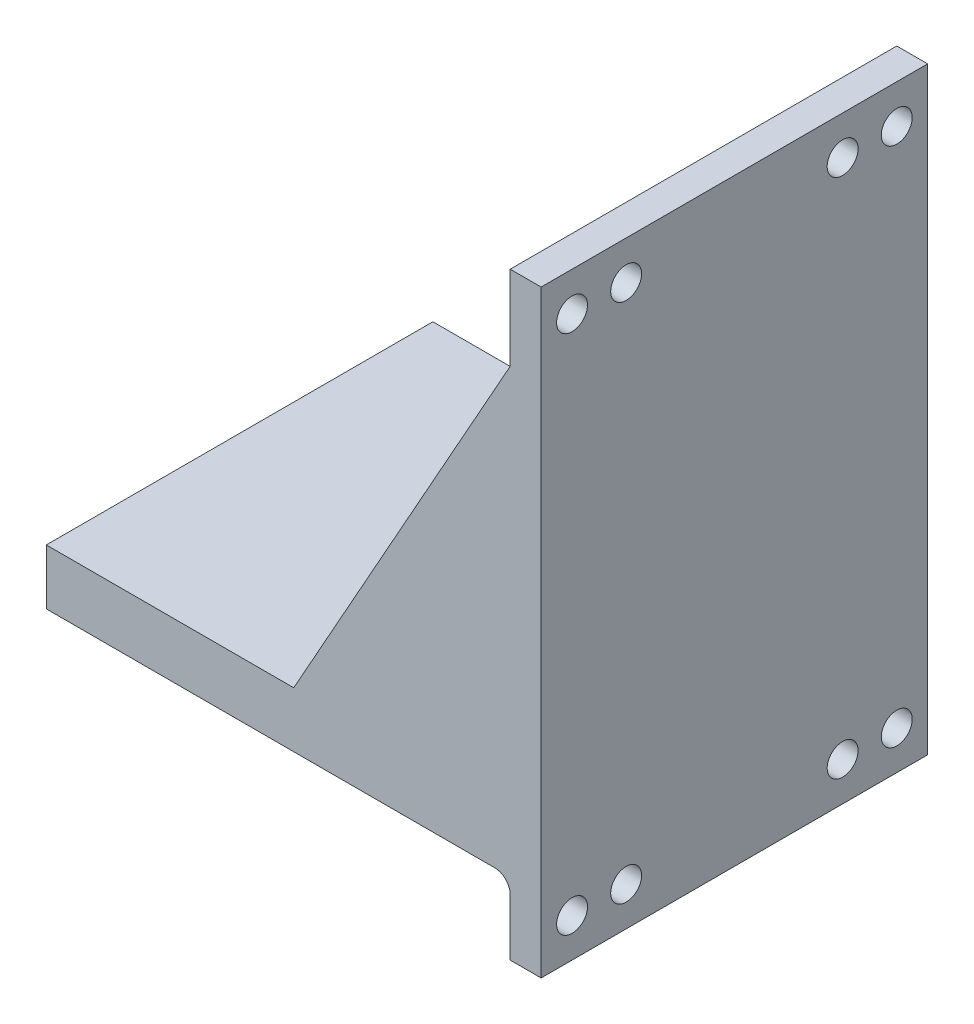
ISO-10303-21;
HEADER;
FILE_DESCRIPTION(('STEP AP214'),'2;1');
FILE_NAME('part.step','',(''),(''),'','','');
FILE_SCHEMA(('AUTOMOTIVE_DESIGN { 1 0 10303 214 1 1 1 1 }'));
ENDSEC;
DATA;
#1=APPLICATION_CONTEXT('core data for automotive mechanical design processes');
#2=APPLICATION_PROTOCOL_DEFINITION('international standard','automotive_design',2000,#1);
#3=PRODUCT_CONTEXT('',#1,'mechanical');
#4=PRODUCT('Part','Part','',(#3));
#5=PRODUCT_RELATED_PRODUCT_CATEGORY('part','',(#4));
#6=PRODUCT_DEFINITION_FORMATION('','',#4);
#7=PRODUCT_DEFINITION_CONTEXT('part definition',#1,'design');
#8=PRODUCT_DEFINITION('design','',#6,#7);
#9=PRODUCT_DEFINITION_SHAPE('','',#8);
#10=(LENGTH_UNIT() NAMED_UNIT(*) SI_UNIT(.MILLI.,.METRE.));
#11=(NAMED_UNIT(*) PLANE_ANGLE_UNIT() SI_UNIT($,.RADIAN.));
#12=(NAMED_UNIT(*) SI_UNIT($,.STERADIAN.) SOLID_ANGLE_UNIT());
#13=UNCERTAINTY_MEASURE_WITH_UNIT(LENGTH_MEASURE(1.E-05),#10,'distance_accuracy_value','');
#14=(GEOMETRIC_REPRESENTATION_CONTEXT(3) GLOBAL_UNCERTAINTY_ASSIGNED_CONTEXT((#13)) GLOBAL_UNIT_ASSIGNED_CONTEXT((#10,
#11,#12)) REPRESENTATION_CONTEXT('',''));
#15=CARTESIAN_POINT('',(0.,0.,0.));
#16=DIRECTION('',(0.,0.,1.));
#17=DIRECTION('',(1.,0.,0.));
#18=AXIS2_PLACEMENT_3D('',#15,#16,#17);
#19=CARTESIAN_POINT('',(-12.,0.,0.));
#20=DIRECTION('',(-1.,0.,0.));
#21=DIRECTION('',(0.,0.,1.));
#22=AXIS2_PLACEMENT_3D('',#19,#20,#21);
#23=PLANE('',#22);
#24=DIRECTION('',(0.,1.,0.));
#25=VECTOR('',#24,1.);
#26=CARTESIAN_POINT('',(-12.,-22.188809941931,43.1107059078754));
#27=LINE('',#26,#25);
#28=CARTESIAN_POINT('',(-12.,-31.3570983107345,43.1107059078754));
#29=VERTEX_POINT('',#28);
#30=CARTESIAN_POINT('',(-12.,-22.188809941931,43.1107059078754));
#31=VERTEX_POINT('',#30);
#32=EDGE_CURVE('E57',#29,#31,#27,.T.);
#33=ORIENTED_EDGE('',*,*,#32,.F.);
#34=DIRECTION('',(0.,0.,1.));
#35=VECTOR('',#34,1.);
#36=CARTESIAN_POINT('',(-12.,-31.3570983107345,0.));
#37=LINE('',#36,#35);
#38=CARTESIAN_POINT('',(-12.,-31.3570983107345,30.1107059078754));
#39=VERTEX_POINT('',#38);
#40=EDGE_CURVE('E63',#29,#39,#37,.F.);
#41=ORIENTED_EDGE('',*,*,#40,.T.);
#42=DIRECTION('',(0.,-1.,0.));
#43=VECTOR('',#42,1.);
#44=CARTESIAN_POINT('',(-12.,38.7,30.1107059078754));
#45=LINE('',#44,#43);
#46=CARTESIAN_POINT('',(-12.,-38.7,30.1107059078754));
#47=VERTEX_POINT('',#46);
#48=EDGE_CURVE('E301',#39,#47,#45,.T.);
#49=ORIENTED_EDGE('',*,*,#48,.T.);
#50=DIRECTION('',(0.,0.,1.));
#51=VECTOR('',#50,1.);
#52=CARTESIAN_POINT('',(-12.,-38.7,30.1107059078754));
#53=LINE('',#52,#51);
#54=CARTESIAN_POINT('',(-12.,-38.7,80.1107059078754));
#55=VERTEX_POINT('',#54);
#56=EDGE_CURVE('E297',#47,#55,#53,.T.);
#57=ORIENTED_EDGE('',*,*,#56,.T.);
#58=DIRECTION('',(0.,1.,0.));
#59=VECTOR('',#58,1.);
#60=CARTESIAN_POINT('',(-12.,38.7,80.1107059078754));
#61=LINE('',#60,#59);
#62=CARTESIAN_POINT('',(-12.,-31.3570983107345,80.1107059078754));
#63=VERTEX_POINT('',#62);
#64=EDGE_CURVE('E302',#55,#63,#61,.T.);
#65=ORIENTED_EDGE('',*,*,#64,.T.);
#66=DIRECTION('',(0.,0.,1.));
#67=VECTOR('',#66,1.);
#68=CARTESIAN_POINT('',(-12.,-31.3570983107345,0.));
#69=LINE('',#68,#67);
#70=CARTESIAN_POINT('',(-12.,-31.3570983107345,56.1107059078754));
#71=VERTEX_POINT('',#70);
#72=EDGE_CURVE('E333',#63,#71,#69,.F.);
#73=ORIENTED_EDGE('',*,*,#72,.T.);
#74=DIRECTION('',(0.,1.,0.));
#75=VECTOR('',#74,1.);
#76=CARTESIAN_POINT('',(-12.,-38.7,56.1107059078754));
#77=LINE('',#76,#75);
#78=CARTESIAN_POINT('',(-12.,-22.188809941931,56.1107059078754));
#79=VERTEX_POINT('',#78);
#80=EDGE_CURVE('E224',#71,#79,#77,.T.);
#81=ORIENTED_EDGE('',*,*,#80,.T.);
#82=DIRECTION('',(0.,0.,-1.));
#83=VECTOR('',#82,1.);
#84=CARTESIAN_POINT('',(-12.,-22.188809941931,80.1107059078754));
#85=LINE('',#84,#83);
#86=CARTESIAN_POINT('',(-12.,-22.188809941931,66.1107059078754));
#87=VERTEX_POINT('',#86);
#88=EDGE_CURVE('E228',#87,#79,#85,.T.);
#89=ORIENTED_EDGE('',*,*,#88,.F.);
#90=DIRECTION('',(0.,1.,0.));
#91=VECTOR('',#90,1.);
#92=CARTESIAN_POINT('',(-12.,0.,66.1107059078754));
#93=LINE('',#92,#91);
#94=CARTESIAN_POINT('',(-12.,27.811190058069,66.1107059078754));
#95=VERTEX_POINT('',#94);
#96=EDGE_CURVE('E214',#87,#95,#93,.T.);
#97=ORIENTED_EDGE('',*,*,#96,.T.);
#98=DIRECTION('',(0.,0.,1.));
#99=VECTOR('',#98,1.);
#100=CARTESIAN_POINT('',(-12.,27.811190058069,0.));
#101=LINE('',#100,#99);
#102=CARTESIAN_POINT('',(-12.,27.811190058069,80.1107059078754));
#103=VERTEX_POINT('',#102);
#104=EDGE_CURVE('E220',#103,#95,#101,.F.);
#105=ORIENTED_EDGE('',*,*,#104,.F.);
#106=CARTESIAN_POINT('',(-12.,38.7,80.1107059078754));
#107=VERTEX_POINT('',#106);
#108=EDGE_CURVE('E303',#103,#107,#61,.T.);
#109=ORIENTED_EDGE('',*,*,#108,.T.);
#110=DIRECTION('',(0.,0.,-1.));
#111=VECTOR('',#110,1.);
#112=CARTESIAN_POINT('',(-12.,38.7,30.1107059078754));
#113=LINE('',#112,#111);
#114=CARTESIAN_POINT('',(-12.,38.7,30.1107059078754));
#115=VERTEX_POINT('',#114);
#116=EDGE_CURVE('E310',#107,#115,#113,.T.);
#117=ORIENTED_EDGE('',*,*,#116,.T.);
#118=CARTESIAN_POINT('',(-12.,27.811190058069,30.1107059078754));
#119=VERTEX_POINT('',#118);
#120=EDGE_CURVE('E300',#115,#119,#45,.T.);
#121=ORIENTED_EDGE('',*,*,#120,.T.);
#122=DIRECTION('',(0.,0.,-1.));
#123=VECTOR('',#122,1.);
#124=CARTESIAN_POINT('',(-12.,27.811190058069,36.1107059078754));
#125=LINE('',#124,#123);
#126=CARTESIAN_POINT('',(-12.,27.811190058069,36.1107059078754));
#127=VERTEX_POINT('',#126);
#128=EDGE_CURVE('E179',#127,#119,#125,.T.);
#129=ORIENTED_EDGE('',*,*,#128,.F.);
#130=DIRECTION('',(0.,-1.,0.));
#131=VECTOR('',#130,1.);
#132=CARTESIAN_POINT('',(-12.,27.811190058069,36.1107059078754));
#133=LINE('',#132,#131);
#134=CARTESIAN_POINT('',(-12.,-22.188809941931,36.1107059078754));
#135=VERTEX_POINT('',#134);
#136=EDGE_CURVE('E181',#127,#135,#133,.T.);
#137=ORIENTED_EDGE('',*,*,#136,.T.);
#138=DIRECTION('',(0.,0.,-1.));
#139=VECTOR('',#138,1.);
#140=CARTESIAN_POINT('',(-12.,-22.188809941931,30.1107059078754));
#141=LINE('',#140,#139);
#142=EDGE_CURVE('E194',#31,#135,#141,.T.);
#143=ORIENTED_EDGE('',*,*,#142,.F.);
#144=EDGE_LOOP('',(#33,#41,#49,#57,#65,#73,#81,#89,#97,#105,#109,#117,#121,#129,#137,#143));
#145=FACE_BOUND('',#144,.T.);
#146=CARTESIAN_POINT('',(-12.,-33.7,76.1107059078754));
#147=DIRECTION('',(-1.,0.,0.));
#148=DIRECTION('',(0.,0.,-1.));
#149=AXIS2_PLACEMENT_3D('',#146,#147,#148);
#150=CIRCLE('',#149,2.);
#151=CARTESIAN_POINT('',(-12.,-33.7,74.1107059078754));
#152=VERTEX_POINT('',#151);
#153=EDGE_CURVE('E248',#152,#152,#150,.T.);
#154=ORIENTED_EDGE('',*,*,#153,.F.);
#155=EDGE_LOOP('',(#154));
#156=FACE_BOUND('',#155,.T.);
#157=CARTESIAN_POINT('',(-12.,-33.7,69.1107059078754));
#158=DIRECTION('',(-1.,0.,0.));
#159=DIRECTION('',(0.,0.,-1.));
#160=AXIS2_PLACEMENT_3D('',#157,#158,#159);
#161=CIRCLE('',#160,2.);
#162=CARTESIAN_POINT('',(-12.,-33.7,67.1107059078754));
#163=VERTEX_POINT('',#162);
#164=EDGE_CURVE('E253',#163,#163,#161,.T.);
#165=ORIENTED_EDGE('',*,*,#164,.F.);
#166=EDGE_LOOP('',(#165));
#167=FACE_BOUND('',#166,.T.);
#168=CARTESIAN_POINT('',(-12.,-33.7,41.1107059078754));
#169=DIRECTION('',(-1.,0.,0.));
#170=DIRECTION('',(0.,0.,-1.));
#171=AXIS2_PLACEMENT_3D('',#168,#169,#170);
#172=CIRCLE('',#171,2.);
#173=CARTESIAN_POINT('',(-12.,-33.7,39.1107059078754));
#174=VERTEX_POINT('',#173);
#175=EDGE_CURVE('E264',#174,#174,#172,.T.);
#176=ORIENTED_EDGE('',*,*,#175,.F.);
#177=EDGE_LOOP('',(#176));
#178=FACE_BOUND('',#177,.T.);
#179=CARTESIAN_POINT('',(-12.,-33.7,34.1107059078754));
#180=DIRECTION('',(-1.,0.,0.));
#181=DIRECTION('',(0.,0.,-1.));
#182=AXIS2_PLACEMENT_3D('',#179,#180,#181);
#183=CIRCLE('',#182,2.);
#184=CARTESIAN_POINT('',(-12.,-33.7,32.1107059078754));
#185=VERTEX_POINT('',#184);
#186=EDGE_CURVE('E267',#185,#185,#183,.T.);
#187=ORIENTED_EDGE('',*,*,#186,.F.);
#188=EDGE_LOOP('',(#187));
#189=FACE_BOUND('',#188,.T.);
#190=CARTESIAN_POINT('',(-12.,33.7,76.1107059078754));
#191=DIRECTION('',(-1.,0.,0.));
#192=DIRECTION('',(0.,0.,1.));
#193=AXIS2_PLACEMENT_3D('',#190,#191,#192);
#194=CIRCLE('',#193,2.);
#195=CARTESIAN_POINT('',(-12.,33.7,78.1107059078754));
#196=VERTEX_POINT('',#195);
#197=EDGE_CURVE('E271',#196,#196,#194,.T.);
#198=ORIENTED_EDGE('',*,*,#197,.F.);
#199=EDGE_LOOP('',(#198));
#200=FACE_BOUND('',#199,.T.);
#201=CARTESIAN_POINT('',(-12.,33.7,41.1107059078754));
#202=DIRECTION('',(-1.,0.,0.));
#203=DIRECTION('',(0.,0.,1.));
#204=AXIS2_PLACEMENT_3D('',#201,#202,#203);
#205=CIRCLE('',#204,2.);
#206=CARTESIAN_POINT('',(-12.,33.7,43.1107059078754));
#207=VERTEX_POINT('',#206);
#208=EDGE_CURVE('E282',#207,#207,#205,.T.);
#209=ORIENTED_EDGE('',*,*,#208,.F.);
#210=EDGE_LOOP('',(#209));
#211=FACE_BOUND('',#210,.T.);
#212=CARTESIAN_POINT('',(-12.,33.7,34.1107059078754));
#213=DIRECTION('',(-1.,0.,0.));
#214=DIRECTION('',(0.,0.,1.));
#215=AXIS2_PLACEMENT_3D('',#212,#213,#214);
#216=CIRCLE('',#215,2.);
#217=CARTESIAN_POINT('',(-12.,33.7,36.1107059078754));
#218=VERTEX_POINT('',#217);
#219=EDGE_CURVE('E293',#218,#218,#216,.T.);
#220=ORIENTED_EDGE('',*,*,#219,.F.);
#221=EDGE_LOOP('',(#220));
#222=FACE_BOUND('',#221,.T.);
#223=CARTESIAN_POINT('',(-12.,33.7,69.1107059078754));
#224=DIRECTION('',(-1.,0.,0.));
#225=DIRECTION('',(0.,0.,1.));
#226=AXIS2_PLACEMENT_3D('',#223,#224,#225);
#227=CIRCLE('',#226,2.);
#228=CARTESIAN_POINT('',(-12.,33.7,71.1107059078754));
#229=VERTEX_POINT('',#228);
#230=EDGE_CURVE('E280',#229,#229,#227,.T.);
#231=ORIENTED_EDGE('',*,*,#230,.F.);
#232=EDGE_LOOP('',(#231));
#233=FACE_BOUND('',#232,.T.);
#234=ADVANCED_FACE('F41',(#145,#156,#167,#178,#189,#200,#211,#222,#233),#23,.T.);
#235=CARTESIAN_POINT('',(-8.,0.,0.));
#236=DIRECTION('',(-1.,0.,0.));
#237=DIRECTION('',(0.,0.,1.));
#238=AXIS2_PLACEMENT_3D('',#235,#236,#237);
#239=PLANE('',#238);
#240=CARTESIAN_POINT('',(-8.,33.7,76.1107059078754));
#241=DIRECTION('',(-1.,0.,0.));
#242=DIRECTION('',(0.,0.,1.));
#243=AXIS2_PLACEMENT_3D('',#240,#241,#242);
#244=CIRCLE('',#243,2.);
#245=CARTESIAN_POINT('',(-8.,33.7,78.1107059078754));
#246=VERTEX_POINT('',#245);
#247=EDGE_CURVE('E270',#246,#246,#244,.T.);
#248=ORIENTED_EDGE('',*,*,#247,.T.);
#249=EDGE_LOOP('',(#248));
#250=FACE_BOUND('',#249,.T.);
#251=CARTESIAN_POINT('',(-8.,33.7,69.1107059078754));
#252=DIRECTION('',(-1.,0.,0.));
#253=DIRECTION('',(0.,0.,1.));
#254=AXIS2_PLACEMENT_3D('',#251,#252,#253);
#255=CIRCLE('',#254,2.);
#256=CARTESIAN_POINT('',(-8.,33.7,71.1107059078754));
#257=VERTEX_POINT('',#256);
#258=EDGE_CURVE('E278',#257,#257,#255,.T.);
#259=ORIENTED_EDGE('',*,*,#258,.T.);
#260=EDGE_LOOP('',(#259));
#261=FACE_BOUND('',#260,.T.);
#262=CARTESIAN_POINT('',(-8.,33.7,34.1107059078754));
#263=DIRECTION('',(-1.,0.,0.));
#264=DIRECTION('',(0.,0.,1.));
#265=AXIS2_PLACEMENT_3D('',#262,#263,#264);
#266=CIRCLE('',#265,2.);
#267=CARTESIAN_POINT('',(-8.,33.7,36.1107059078754));
#268=VERTEX_POINT('',#267);
#269=EDGE_CURVE('E289',#268,#268,#266,.T.);
#270=ORIENTED_EDGE('',*,*,#269,.T.);
#271=EDGE_LOOP('',(#270));
#272=FACE_BOUND('',#271,.T.);
#273=CARTESIAN_POINT('',(-8.,33.7,41.1107059078754));
#274=DIRECTION('',(-1.,0.,0.));
#275=DIRECTION('',(0.,0.,1.));
#276=AXIS2_PLACEMENT_3D('',#273,#274,#275);
#277=CIRCLE('',#276,2.);
#278=CARTESIAN_POINT('',(-8.,33.7,43.1107059078754));
#279=VERTEX_POINT('',#278);
#280=EDGE_CURVE('E281',#279,#279,#277,.T.);
#281=ORIENTED_EDGE('',*,*,#280,.T.);
#282=EDGE_LOOP('',(#281));
#283=FACE_BOUND('',#282,.T.);
#284=DIRECTION('',(0.,0.,-1.));
#285=VECTOR('',#284,1.);
#286=CARTESIAN_POINT('',(-8.,38.7,30.1107059078754));
#287=LINE('',#286,#285);
#288=CARTESIAN_POINT('',(-8.,38.7,80.1107059078754));
#289=VERTEX_POINT('',#288);
#290=CARTESIAN_POINT('',(-8.,38.7,30.1107059078754));
#291=VERTEX_POINT('',#290);
#292=EDGE_CURVE('E317',#289,#291,#287,.T.);
#293=ORIENTED_EDGE('',*,*,#292,.F.);
#294=DIRECTION('',(0.,1.,0.));
#295=VECTOR('',#294,1.);
#296=CARTESIAN_POINT('',(-8.,38.7,80.1107059078754));
#297=LINE('',#296,#295);
#298=CARTESIAN_POINT('',(-8.,-38.7,80.1107059078754));
#299=VERTEX_POINT('',#298);
#300=EDGE_CURVE('E313',#299,#289,#297,.T.);
#301=ORIENTED_EDGE('',*,*,#300,.F.);
#302=DIRECTION('',(0.,0.,1.));
#303=VECTOR('',#302,1.);
#304=CARTESIAN_POINT('',(-8.,-38.7,30.1107059078754));
#305=LINE('',#304,#303);
#306=CARTESIAN_POINT('',(-8.,-38.7,30.1107059078754));
#307=VERTEX_POINT('',#306);
#308=EDGE_CURVE('E315',#307,#299,#305,.T.);
#309=ORIENTED_EDGE('',*,*,#308,.F.);
#310=DIRECTION('',(0.,-1.,0.));
#311=VECTOR('',#310,1.);
#312=CARTESIAN_POINT('',(-8.,38.7,30.1107059078754));
#313=LINE('',#312,#311);
#314=EDGE_CURVE('E295',#291,#307,#313,.T.);
#315=ORIENTED_EDGE('',*,*,#314,.F.);
#316=EDGE_LOOP('',(#293,#301,#309,#315));
#317=FACE_BOUND('',#316,.T.);
#318=CARTESIAN_POINT('',(-8.,-33.7,34.1107059078754));
#319=DIRECTION('',(-1.,0.,0.));
#320=DIRECTION('',(0.,0.,-1.));
#321=AXIS2_PLACEMENT_3D('',#318,#319,#320);
#322=CIRCLE('',#321,2.);
#323=CARTESIAN_POINT('',(-8.,-33.7,32.1107059078754));
#324=VERTEX_POINT('',#323);
#325=EDGE_CURVE('E263',#324,#324,#322,.T.);
#326=ORIENTED_EDGE('',*,*,#325,.T.);
#327=EDGE_LOOP('',(#326));
#328=FACE_BOUND('',#327,.T.);
#329=CARTESIAN_POINT('',(-8.,-33.7,41.1107059078754));
#330=DIRECTION('',(-1.,0.,0.));
#331=DIRECTION('',(0.,0.,-1.));
#332=AXIS2_PLACEMENT_3D('',#329,#330,#331);
#333=CIRCLE('',#332,2.);
#334=CARTESIAN_POINT('',(-8.,-33.7,39.1107059078754));
#335=VERTEX_POINT('',#334);
#336=EDGE_CURVE('E257',#335,#335,#333,.T.);
#337=ORIENTED_EDGE('',*,*,#336,.T.);
#338=EDGE_LOOP('',(#337));
#339=FACE_BOUND('',#338,.T.);
#340=CARTESIAN_POINT('',(-8.,-33.7,76.1107059078754));
#341=DIRECTION('',(-1.,0.,0.));
#342=DIRECTION('',(0.,0.,-1.));
#343=AXIS2_PLACEMENT_3D('',#340,#341,#342);
#344=CIRCLE('',#343,2.);
#345=CARTESIAN_POINT('',(-8.,-33.7,74.1107059078754));
#346=VERTEX_POINT('',#345);
#347=EDGE_CURVE('E247',#346,#346,#344,.T.);
#348=ORIENTED_EDGE('',*,*,#347,.T.);
#349=EDGE_LOOP('',(#348));
#350=FACE_BOUND('',#349,.T.);
#351=CARTESIAN_POINT('',(-8.,-33.7,69.1107059078754));
#352=DIRECTION('',(-1.,0.,0.));
#353=DIRECTION('',(0.,0.,-1.));
#354=AXIS2_PLACEMENT_3D('',#351,#352,#353);
#355=CIRCLE('',#354,2.);
#356=CARTESIAN_POINT('',(-8.,-33.7,67.1107059078754));
#357=VERTEX_POINT('',#356);
#358=EDGE_CURVE('E255',#357,#357,#355,.T.);
#359=ORIENTED_EDGE('',*,*,#358,.T.);
#360=EDGE_LOOP('',(#359));
#361=FACE_BOUND('',#360,.T.);
#362=ADVANCED_FACE('F426',(#250,#261,#272,#283,#317,#328,#339,#350,#361),#239,.F.);
#363=CARTESIAN_POINT('',(-12.,38.7,30.1107059078754));
#364=DIRECTION('',(0.,0.,1.));
#365=DIRECTION('',(1.,0.,0.));
#366=AXIS2_PLACEMENT_3D('',#363,#364,#365);
#367=PLANE('',#366);
#368=DIRECTION('',(1.,0.,0.));
#369=VECTOR('',#368,1.);
#370=CARTESIAN_POINT('',(-72.,-22.188809941931,30.1107059078754));
#371=LINE('',#370,#369);
#372=CARTESIAN_POINT('',(-72.,-22.188809941931,30.1107059078754));
#373=VERTEX_POINT('',#372);
#374=CARTESIAN_POINT('',(-42.,-22.188809941931,30.1107059078754));
#375=VERTEX_POINT('',#374);
#376=EDGE_CURVE('E242',#373,#375,#371,.T.);
#377=ORIENTED_EDGE('',*,*,#376,.T.);
#378=DIRECTION('',(0.514495755427526,0.857492925712544,0.));
#379=VECTOR('',#378,1.);
#380=CARTESIAN_POINT('',(-42.,-22.188809941931,30.1107059078754));
#381=LINE('',#380,#379);
#382=EDGE_CURVE('E174',#375,#119,#381,.T.);
#383=ORIENTED_EDGE('',*,*,#382,.T.);
#384=ORIENTED_EDGE('',*,*,#120,.F.);
#385=DIRECTION('',(1.,0.,0.));
#386=VECTOR('',#385,1.);
#387=CARTESIAN_POINT('',(-12.,38.7,30.1107059078754));
#388=LINE('',#387,#386);
#389=EDGE_CURVE('E307',#115,#291,#388,.T.);
#390=ORIENTED_EDGE('',*,*,#389,.T.);
#391=ORIENTED_EDGE('',*,*,#314,.T.);
#392=DIRECTION('',(1.,0.,0.));
#393=VECTOR('',#392,1.);
#394=CARTESIAN_POINT('',(-12.,-38.7,30.1107059078754));
#395=LINE('',#394,#393);
#396=EDGE_CURVE('E329',#47,#307,#395,.T.);
#397=ORIENTED_EDGE('',*,*,#396,.F.);
#398=ORIENTED_EDGE('',*,*,#48,.F.);
#399=CARTESIAN_POINT('',(-14.,-31.3570983107345,30.1107059078754));
#400=DIRECTION('',(0.,0.,1.));
#401=DIRECTION('',(1.,0.,0.));
#402=AXIS2_PLACEMENT_3D('',#399,#400,#401);
#403=CIRCLE('',#402,2.);
#404=CARTESIAN_POINT('',(-14.,-29.3570983107345,30.1107059078754));
#405=VERTEX_POINT('',#404);
#406=EDGE_CURVE('E11',#39,#405,#403,.T.);
#407=ORIENTED_EDGE('',*,*,#406,.T.);
#408=DIRECTION('',(1.,0.,0.));
#409=VECTOR('',#408,1.);
#410=CARTESIAN_POINT('',(-72.,-29.3570983107345,30.1107059078754));
#411=LINE('',#410,#409);
#412=CARTESIAN_POINT('',(-72.,-29.3570983107345,30.1107059078754));
#413=VERTEX_POINT('',#412);
#414=EDGE_CURVE('E241',#413,#405,#411,.T.);
#415=ORIENTED_EDGE('',*,*,#414,.F.);
#416=DIRECTION('',(0.,-1.,0.));
#417=VECTOR('',#416,1.);
#418=CARTESIAN_POINT('',(-72.,-29.3570983107345,30.1107059078754));
#419=LINE('',#418,#417);
#420=EDGE_CURVE('E235',#373,#413,#419,.T.);
#421=ORIENTED_EDGE('',*,*,#420,.F.);
#422=EDGE_LOOP('',(#377,#383,#384,#390,#391,#397,#398,#407,#415,#421));
#423=FACE_BOUND('',#422,.T.);
#424=ADVANCED_FACE('F369',(#423),#367,.F.);
#425=CARTESIAN_POINT('',(-12.,-38.7,30.1107059078754));
#426=DIRECTION('',(0.,1.,0.));
#427=DIRECTION('',(0.,0.,1.));
#428=AXIS2_PLACEMENT_3D('',#425,#426,#427);
#429=PLANE('',#428);
#430=DIRECTION('',(1.,0.,0.));
#431=VECTOR('',#430,1.);
#432=CARTESIAN_POINT('',(-12.,-38.7,80.1107059078754));
#433=LINE('',#432,#431);
#434=EDGE_CURVE('E322',#55,#299,#433,.T.);
#435=ORIENTED_EDGE('',*,*,#434,.F.);
#436=ORIENTED_EDGE('',*,*,#56,.F.);
#437=ORIENTED_EDGE('',*,*,#396,.T.);
#438=ORIENTED_EDGE('',*,*,#308,.T.);
#439=EDGE_LOOP('',(#435,#436,#437,#438));
#440=FACE_BOUND('',#439,.T.);
#441=ADVANCED_FACE('F450',(#440),#429,.F.);
#442=CARTESIAN_POINT('',(-12.,38.7,80.1107059078754));
#443=DIRECTION('',(0.,0.,-1.));
#444=DIRECTION('',(-1.,0.,0.));
#445=AXIS2_PLACEMENT_3D('',#442,#443,#444);
#446=PLANE('',#445);
#447=ORIENTED_EDGE('',*,*,#108,.F.);
#448=DIRECTION('',(0.488603368931843,0.87250601594972,0.));
#449=VECTOR('',#448,1.);
#450=CARTESIAN_POINT('',(-40.,-22.188809941931,80.1107059078754));
#451=LINE('',#450,#449);
#452=CARTESIAN_POINT('',(-40.,-22.188809941931,80.1107059078754));
#453=VERTEX_POINT('',#452);
#454=EDGE_CURVE('E207',#453,#103,#451,.T.);
#455=ORIENTED_EDGE('',*,*,#454,.F.);
#456=DIRECTION('',(1.,0.,0.));
#457=VECTOR('',#456,1.);
#458=CARTESIAN_POINT('',(-72.,-22.188809941931,80.1107059078754));
#459=LINE('',#458,#457);
#460=CARTESIAN_POINT('',(-72.,-22.188809941931,80.1107059078754));
#461=VERTEX_POINT('',#460);
#462=EDGE_CURVE('E246',#461,#453,#459,.T.);
#463=ORIENTED_EDGE('',*,*,#462,.F.);
#464=DIRECTION('',(0.,1.,0.));
#465=VECTOR('',#464,1.);
#466=CARTESIAN_POINT('',(-72.,-29.3570983107345,80.1107059078754));
#467=LINE('',#466,#465);
#468=CARTESIAN_POINT('',(-72.,-29.3570983107345,80.1107059078754));
#469=VERTEX_POINT('',#468);
#470=EDGE_CURVE('E227',#469,#461,#467,.T.);
#471=ORIENTED_EDGE('',*,*,#470,.F.);
#472=DIRECTION('',(1.,0.,0.));
#473=VECTOR('',#472,1.);
#474=CARTESIAN_POINT('',(-72.,-29.3570983107345,80.1107059078754));
#475=LINE('',#474,#473);
#476=CARTESIAN_POINT('',(-14.,-29.3570983107345,80.1107059078754));
#477=VERTEX_POINT('',#476);
#478=EDGE_CURVE('E236',#469,#477,#475,.T.);
#479=ORIENTED_EDGE('',*,*,#478,.T.);
#480=CARTESIAN_POINT('',(-14.,-31.3570983107345,80.1107059078754));
#481=DIRECTION('',(0.,0.,-1.));
#482=DIRECTION('',(-1.,0.,0.));
#483=AXIS2_PLACEMENT_3D('',#480,#481,#482);
#484=CIRCLE('',#483,2.);
#485=EDGE_CURVE('E340',#477,#63,#484,.T.);
#486=ORIENTED_EDGE('',*,*,#485,.T.);
#487=ORIENTED_EDGE('',*,*,#64,.F.);
#488=ORIENTED_EDGE('',*,*,#434,.T.);
#489=ORIENTED_EDGE('',*,*,#300,.T.);
#490=DIRECTION('',(1.,0.,0.));
#491=VECTOR('',#490,1.);
#492=CARTESIAN_POINT('',(-12.,38.7,80.1107059078754));
#493=LINE('',#492,#491);
#494=EDGE_CURVE('E318',#107,#289,#493,.T.);
#495=ORIENTED_EDGE('',*,*,#494,.F.);
#496=EDGE_LOOP('',(#447,#455,#463,#471,#479,#486,#487,#488,#489,#495));
#497=FACE_BOUND('',#496,.T.);
#498=ADVANCED_FACE('F390',(#497),#446,.F.);
#499=CARTESIAN_POINT('',(-12.,38.7,30.1107059078754));
#500=DIRECTION('',(0.,-1.,0.));
#501=DIRECTION('',(0.,0.,-1.));
#502=AXIS2_PLACEMENT_3D('',#499,#500,#501);
#503=PLANE('',#502);
#504=ORIENTED_EDGE('',*,*,#292,.T.);
#505=ORIENTED_EDGE('',*,*,#389,.F.);
#506=ORIENTED_EDGE('',*,*,#116,.F.);
#507=ORIENTED_EDGE('',*,*,#494,.T.);
#508=EDGE_LOOP('',(#504,#505,#506,#507));
#509=FACE_BOUND('',#508,.T.);
#510=ADVANCED_FACE('F441',(#509),#503,.F.);
#511=CARTESIAN_POINT('',(-12.,33.7,34.1107059078754));
#512=DIRECTION('',(1.,0.,0.));
#513=DIRECTION('',(0.,0.,-1.));
#514=AXIS2_PLACEMENT_3D('',#511,#512,#513);
#515=CYLINDRICAL_SURFACE('',#514,2.);
#516=ORIENTED_EDGE('',*,*,#219,.T.);
#517=EDGE_LOOP('',(#516));
#518=FACE_BOUND('',#517,.T.);
#519=ORIENTED_EDGE('',*,*,#269,.F.);
#520=EDGE_LOOP('',(#519));
#521=FACE_BOUND('',#520,.T.);
#522=ADVANCED_FACE('F438',(#518,#521),#515,.F.);
#523=CARTESIAN_POINT('',(-12.,33.7,41.1107059078754));
#524=DIRECTION('',(1.,0.,0.));
#525=DIRECTION('',(0.,0.,-1.));
#526=AXIS2_PLACEMENT_3D('',#523,#524,#525);
#527=CYLINDRICAL_SURFACE('',#526,2.);
#528=ORIENTED_EDGE('',*,*,#208,.T.);
#529=EDGE_LOOP('',(#528));
#530=FACE_BOUND('',#529,.T.);
#531=ORIENTED_EDGE('',*,*,#280,.F.);
#532=EDGE_LOOP('',(#531));
#533=FACE_BOUND('',#532,.T.);
#534=ADVANCED_FACE('F606',(#530,#533),#527,.F.);
#535=CARTESIAN_POINT('',(-12.,33.7,69.1107059078754));
#536=DIRECTION('',(1.,0.,0.));
#537=DIRECTION('',(0.,0.,-1.));
#538=AXIS2_PLACEMENT_3D('',#535,#536,#537);
#539=CYLINDRICAL_SURFACE('',#538,2.);
#540=ORIENTED_EDGE('',*,*,#258,.F.);
#541=EDGE_LOOP('',(#540));
#542=FACE_BOUND('',#541,.T.);
#543=ORIENTED_EDGE('',*,*,#230,.T.);
#544=EDGE_LOOP('',(#543));
#545=FACE_BOUND('',#544,.T.);
#546=ADVANCED_FACE('F596',(#542,#545),#539,.F.);
#547=CARTESIAN_POINT('',(-12.,33.7,76.1107059078754));
#548=DIRECTION('',(1.,0.,0.));
#549=DIRECTION('',(0.,0.,-1.));
#550=AXIS2_PLACEMENT_3D('',#547,#548,#549);
#551=CYLINDRICAL_SURFACE('',#550,2.);
#552=ORIENTED_EDGE('',*,*,#247,.F.);
#553=EDGE_LOOP('',(#552));
#554=FACE_BOUND('',#553,.T.);
#555=ORIENTED_EDGE('',*,*,#197,.T.);
#556=EDGE_LOOP('',(#555));
#557=FACE_BOUND('',#556,.T.);
#558=ADVANCED_FACE('F588',(#554,#557),#551,.F.);
#559=CARTESIAN_POINT('',(-12.,-33.7,34.1107059078754));
#560=DIRECTION('',(1.,0.,0.));
#561=DIRECTION('',(0.,0.,-1.));
#562=AXIS2_PLACEMENT_3D('',#559,#560,#561);
#563=CYLINDRICAL_SURFACE('',#562,2.);
#564=ORIENTED_EDGE('',*,*,#186,.T.);
#565=EDGE_LOOP('',(#564));
#566=FACE_BOUND('',#565,.T.);
#567=ORIENTED_EDGE('',*,*,#325,.F.);
#568=EDGE_LOOP('',(#567));
#569=FACE_BOUND('',#568,.T.);
#570=ADVANCED_FACE('F578',(#566,#569),#563,.F.);
#571=CARTESIAN_POINT('',(-12.,-33.7,41.1107059078754));
#572=DIRECTION('',(1.,0.,0.));
#573=DIRECTION('',(0.,0.,-1.));
#574=AXIS2_PLACEMENT_3D('',#571,#572,#573);
#575=CYLINDRICAL_SURFACE('',#574,2.);
#576=ORIENTED_EDGE('',*,*,#175,.T.);
#577=EDGE_LOOP('',(#576));
#578=FACE_BOUND('',#577,.T.);
#579=ORIENTED_EDGE('',*,*,#336,.F.);
#580=EDGE_LOOP('',(#579));
#581=FACE_BOUND('',#580,.T.);
#582=ADVANCED_FACE('F571',(#578,#581),#575,.F.);
#583=CARTESIAN_POINT('',(-12.,-33.7,69.1107059078754));
#584=DIRECTION('',(1.,0.,0.));
#585=DIRECTION('',(0.,0.,-1.));
#586=AXIS2_PLACEMENT_3D('',#583,#584,#585);
#587=CYLINDRICAL_SURFACE('',#586,2.);
#588=ORIENTED_EDGE('',*,*,#164,.T.);
#589=EDGE_LOOP('',(#588));
#590=FACE_BOUND('',#589,.T.);
#591=ORIENTED_EDGE('',*,*,#358,.F.);
#592=EDGE_LOOP('',(#591));
#593=FACE_BOUND('',#592,.T.);
#594=ADVANCED_FACE('F561',(#590,#593),#587,.F.);
#595=CARTESIAN_POINT('',(-12.,-33.7,76.1107059078754));
#596=DIRECTION('',(1.,0.,0.));
#597=DIRECTION('',(0.,0.,-1.));
#598=AXIS2_PLACEMENT_3D('',#595,#596,#597);
#599=CYLINDRICAL_SURFACE('',#598,2.);
#600=ORIENTED_EDGE('',*,*,#153,.T.);
#601=EDGE_LOOP('',(#600));
#602=FACE_BOUND('',#601,.T.);
#603=ORIENTED_EDGE('',*,*,#347,.F.);
#604=EDGE_LOOP('',(#603));
#605=FACE_BOUND('',#604,.T.);
#606=ADVANCED_FACE('F492',(#602,#605),#599,.F.);
#607=CARTESIAN_POINT('',(-72.,-22.188809941931,80.1107059078754));
#608=DIRECTION('',(0.,-1.,0.));
#609=DIRECTION('',(0.,0.,-1.));
#610=AXIS2_PLACEMENT_3D('',#607,#608,#609);
#611=PLANE('',#610);
#612=DIRECTION('',(-1.,0.,0.));
#613=VECTOR('',#612,1.);
#614=CARTESIAN_POINT('',(-12.,-22.188809941931,36.1107059078754));
#615=LINE('',#614,#613);
#616=CARTESIAN_POINT('',(-42.,-22.188809941931,36.1107059078754));
#617=VERTEX_POINT('',#616);
#618=EDGE_CURVE('E184',#135,#617,#615,.T.);
#619=ORIENTED_EDGE('',*,*,#618,.T.);
#620=DIRECTION('',(0.,0.,-1.));
#621=VECTOR('',#620,1.);
#622=CARTESIAN_POINT('',(-42.,-22.188809941931,36.1107059078754));
#623=LINE('',#622,#621);
#624=EDGE_CURVE('E169',#617,#375,#623,.T.);
#625=ORIENTED_EDGE('',*,*,#624,.T.);
#626=ORIENTED_EDGE('',*,*,#376,.F.);
#627=DIRECTION('',(0.,0.,-1.));
#628=VECTOR('',#627,1.);
#629=CARTESIAN_POINT('',(-72.,-22.188809941931,80.1107059078754));
#630=LINE('',#629,#628);
#631=EDGE_CURVE('E229',#461,#373,#630,.T.);
#632=ORIENTED_EDGE('',*,*,#631,.F.);
#633=ORIENTED_EDGE('',*,*,#462,.T.);
#634=DIRECTION('',(0.,0.,1.));
#635=VECTOR('',#634,1.);
#636=CARTESIAN_POINT('',(-40.,-22.188809941931,80.1107059078754));
#637=LINE('',#636,#635);
#638=CARTESIAN_POINT('',(-40.,-22.188809941931,66.1107059078754));
#639=VERTEX_POINT('',#638);
#640=EDGE_CURVE('E215',#453,#639,#637,.F.);
#641=ORIENTED_EDGE('',*,*,#640,.T.);
#642=DIRECTION('',(-1.,0.,0.));
#643=VECTOR('',#642,1.);
#644=CARTESIAN_POINT('',(-72.,-22.188809941931,66.1107059078754));
#645=LINE('',#644,#643);
#646=EDGE_CURVE('E209',#87,#639,#645,.T.);
#647=ORIENTED_EDGE('',*,*,#646,.F.);
#648=ORIENTED_EDGE('',*,*,#88,.T.);
#649=DIRECTION('',(1.,0.,0.));
#650=VECTOR('',#649,1.);
#651=CARTESIAN_POINT('',(-12.,-22.188809941931,56.1107059078754));
#652=LINE('',#651,#650);
#653=CARTESIAN_POINT('',(-20.,-22.188809941931,56.1107059078754));
#654=VERTEX_POINT('',#653);
#655=EDGE_CURVE('E221',#654,#79,#652,.T.);
#656=ORIENTED_EDGE('',*,*,#655,.F.);
#657=CARTESIAN_POINT('',(-20.,-22.188809941931,44.1107059078754));
#658=DIRECTION('',(0.,-1.,0.));
#659=DIRECTION('',(0.,0.,-1.));
#660=AXIS2_PLACEMENT_3D('',#657,#658,#659);
#661=CIRCLE('',#660,12.);
#662=CARTESIAN_POINT('',(-31.1242977306435,-22.188809941931,48.6107059078754));
#663=VERTEX_POINT('',#662);
#664=EDGE_CURVE('E341',#654,#663,#661,.T.);
#665=ORIENTED_EDGE('',*,*,#664,.T.);
#666=CARTESIAN_POINT('',(-27.4161984870957,-22.188809941931,47.1107059078754));
#667=DIRECTION('',(0.,-1.,0.));
#668=DIRECTION('',(0.,0.,-1.));
#669=AXIS2_PLACEMENT_3D('',#666,#667,#668);
#670=CIRCLE('',#669,4.);
#671=CARTESIAN_POINT('',(-27.4161984870957,-22.188809941931,43.1107059078754));
#672=VERTEX_POINT('',#671);
#673=EDGE_CURVE('E357',#663,#672,#670,.T.);
#674=ORIENTED_EDGE('',*,*,#673,.T.);
#675=DIRECTION('',(-1.,0.,0.));
#676=VECTOR('',#675,1.);
#677=CARTESIAN_POINT('',(2.84534803021887,-22.188809941931,43.1107059078754));
#678=LINE('',#677,#676);
#679=EDGE_CURVE('E197',#31,#672,#678,.T.);
#680=ORIENTED_EDGE('',*,*,#679,.F.);
#681=ORIENTED_EDGE('',*,*,#142,.T.);
#682=EDGE_LOOP('',(#619,#625,#626,#632,#633,#641,#647,#648,#656,#665,#674,#680,#681));
#683=FACE_BOUND('',#682,.T.);
#684=ADVANCED_FACE('F188',(#683),#611,.F.);
#685=CARTESIAN_POINT('',(-72.,-29.3570983107345,80.1107059078754));
#686=DIRECTION('',(0.,1.,0.));
#687=DIRECTION('',(0.,0.,1.));
#688=AXIS2_PLACEMENT_3D('',#685,#686,#687);
#689=PLANE('',#688);
#690=ORIENTED_EDGE('',*,*,#414,.T.);
#691=DIRECTION('',(0.,0.,1.));
#692=VECTOR('',#691,1.);
#693=CARTESIAN_POINT('',(-14.,-29.3570983107345,80.1107059078754));
#694=LINE('',#693,#692);
#695=CARTESIAN_POINT('',(-14.,-29.3570983107345,43.1107059078754));
#696=VERTEX_POINT('',#695);
#697=EDGE_CURVE('E360',#405,#696,#694,.T.);
#698=ORIENTED_EDGE('',*,*,#697,.T.);
#699=DIRECTION('',(-1.,0.,0.));
#700=VECTOR('',#699,1.);
#701=CARTESIAN_POINT('',(2.84534803021887,-29.3570983107345,43.1107059078754));
#702=LINE('',#701,#700);
#703=CARTESIAN_POINT('',(-27.4161984870957,-29.3570983107345,43.1107059078754));
#704=VERTEX_POINT('',#703);
#705=EDGE_CURVE('E196',#696,#704,#702,.T.);
#706=ORIENTED_EDGE('',*,*,#705,.T.);
#707=CARTESIAN_POINT('',(-27.4161984870957,-29.3570983107345,47.1107059078754));
#708=DIRECTION('',(0.,1.,0.));
#709=DIRECTION('',(0.,0.,1.));
#710=AXIS2_PLACEMENT_3D('',#707,#708,#709);
#711=CIRCLE('',#710,4.);
#712=CARTESIAN_POINT('',(-31.1242977306435,-29.3570983107345,48.6107059078754));
#713=VERTEX_POINT('',#712);
#714=EDGE_CURVE('E355',#704,#713,#711,.T.);
#715=ORIENTED_EDGE('',*,*,#714,.T.);
#716=CARTESIAN_POINT('',(-20.,-29.3570983107345,44.1107059078754));
#717=DIRECTION('',(0.,1.,0.));
#718=DIRECTION('',(0.,0.,1.));
#719=AXIS2_PLACEMENT_3D('',#716,#717,#718);
#720=CIRCLE('',#719,12.);
#721=CARTESIAN_POINT('',(-20.,-29.3570983107345,56.1107059078754));
#722=VERTEX_POINT('',#721);
#723=EDGE_CURVE('E350',#713,#722,#720,.T.);
#724=ORIENTED_EDGE('',*,*,#723,.T.);
#725=DIRECTION('',(1.,0.,0.));
#726=VECTOR('',#725,1.);
#727=CARTESIAN_POINT('',(-72.,-29.3570983107345,56.1107059078754));
#728=LINE('',#727,#726);
#729=CARTESIAN_POINT('',(-14.,-29.3570983107345,56.1107059078754));
#730=VERTEX_POINT('',#729);
#731=EDGE_CURVE('E328',#722,#730,#728,.T.);
#732=ORIENTED_EDGE('',*,*,#731,.T.);
#733=DIRECTION('',(0.,0.,1.));
#734=VECTOR('',#733,1.);
#735=CARTESIAN_POINT('',(-14.,-29.3570983107345,80.1107059078754));
#736=LINE('',#735,#734);
#737=EDGE_CURVE('E331',#730,#477,#736,.T.);
#738=ORIENTED_EDGE('',*,*,#737,.T.);
#739=ORIENTED_EDGE('',*,*,#478,.F.);
#740=DIRECTION('',(0.,0.,1.));
#741=VECTOR('',#740,1.);
#742=CARTESIAN_POINT('',(-72.,-29.3570983107345,80.1107059078754));
#743=LINE('',#742,#741);
#744=EDGE_CURVE('E234',#413,#469,#743,.T.);
#745=ORIENTED_EDGE('',*,*,#744,.F.);
#746=EDGE_LOOP('',(#690,#698,#706,#715,#724,#732,#738,#739,#745));
#747=FACE_BOUND('',#746,.T.);
#748=ADVANCED_FACE('F374',(#747),#689,.F.);
#749=CARTESIAN_POINT('',(-72.,0.,0.));
#750=DIRECTION('',(-1.,0.,0.));
#751=DIRECTION('',(0.,0.,1.));
#752=AXIS2_PLACEMENT_3D('',#749,#750,#751);
#753=PLANE('',#752);
#754=ORIENTED_EDGE('',*,*,#470,.T.);
#755=ORIENTED_EDGE('',*,*,#631,.T.);
#756=ORIENTED_EDGE('',*,*,#420,.T.);
#757=ORIENTED_EDGE('',*,*,#744,.T.);
#758=EDGE_LOOP('',(#754,#755,#756,#757));
#759=FACE_BOUND('',#758,.T.);
#760=ADVANCED_FACE('F378',(#759),#753,.T.);
#761=CARTESIAN_POINT('',(-12.,-38.7,56.1107059078754));
#762=DIRECTION('',(0.,0.,1.));
#763=DIRECTION('',(1.,0.,0.));
#764=AXIS2_PLACEMENT_3D('',#761,#762,#763);
#765=PLANE('',#764);
#766=ORIENTED_EDGE('',*,*,#731,.F.);
#767=DIRECTION('',(0.,1.,0.));
#768=VECTOR('',#767,1.);
#769=CARTESIAN_POINT('',(-20.,-22.188809941931,56.1107059078754));
#770=LINE('',#769,#768);
#771=EDGE_CURVE('E344',#722,#654,#770,.T.);
#772=ORIENTED_EDGE('',*,*,#771,.T.);
#773=ORIENTED_EDGE('',*,*,#655,.T.);
#774=ORIENTED_EDGE('',*,*,#80,.F.);
#775=CARTESIAN_POINT('',(-14.,-31.3570983107345,56.1107059078754));
#776=DIRECTION('',(0.,0.,1.));
#777=DIRECTION('',(1.,0.,0.));
#778=AXIS2_PLACEMENT_3D('',#775,#776,#777);
#779=CIRCLE('',#778,2.);
#780=EDGE_CURVE('E339',#71,#730,#779,.T.);
#781=ORIENTED_EDGE('',*,*,#780,.T.);
#782=EDGE_LOOP('',(#766,#772,#773,#774,#781));
#783=FACE_BOUND('',#782,.T.);
#784=ADVANCED_FACE('F401',(#783),#765,.F.);
#785=CARTESIAN_POINT('',(-40.,-22.188809941931,80.1107059078754));
#786=DIRECTION('',(0.87250601594972,-0.488603368931843,0.));
#787=DIRECTION('',(0.488603368931843,0.87250601594972,0.));
#788=AXIS2_PLACEMENT_3D('',#785,#786,#787);
#789=PLANE('',#788);
#790=ORIENTED_EDGE('',*,*,#454,.T.);
#791=ORIENTED_EDGE('',*,*,#104,.T.);
#792=DIRECTION('',(0.488603368931843,0.87250601594972,0.));
#793=VECTOR('',#792,1.);
#794=CARTESIAN_POINT('',(-40.,-22.188809941931,66.1107059078754));
#795=LINE('',#794,#793);
#796=EDGE_CURVE('E202',#639,#95,#795,.T.);
#797=ORIENTED_EDGE('',*,*,#796,.F.);
#798=ORIENTED_EDGE('',*,*,#640,.F.);
#799=EDGE_LOOP('',(#790,#791,#797,#798));
#800=FACE_BOUND('',#799,.T.);
#801=ADVANCED_FACE('F389',(#800),#789,.F.);
#802=CARTESIAN_POINT('',(-40.,0.,66.1107059078754));
#803=DIRECTION('',(0.,0.,1.));
#804=DIRECTION('',(1.,0.,0.));
#805=AXIS2_PLACEMENT_3D('',#802,#803,#804);
#806=PLANE('',#805);
#807=ORIENTED_EDGE('',*,*,#96,.F.);
#808=ORIENTED_EDGE('',*,*,#646,.T.);
#809=ORIENTED_EDGE('',*,*,#796,.T.);
#810=EDGE_LOOP('',(#807,#808,#809));
#811=FACE_BOUND('',#810,.T.);
#812=ADVANCED_FACE('F397',(#811),#806,.F.);
#813=CARTESIAN_POINT('',(-14.,-31.3570983107345,80.1107059078754));
#814=DIRECTION('',(0.,0.,1.));
#815=DIRECTION('',(1.,0.,0.));
#816=AXIS2_PLACEMENT_3D('',#813,#814,#815);
#817=CYLINDRICAL_SURFACE('',#816,2.);
#818=ORIENTED_EDGE('',*,*,#780,.F.);
#819=ORIENTED_EDGE('',*,*,#72,.F.);
#820=ORIENTED_EDGE('',*,*,#485,.F.);
#821=ORIENTED_EDGE('',*,*,#737,.F.);
#822=EDGE_LOOP('',(#818,#819,#820,#821));
#823=FACE_BOUND('',#822,.T.);
#824=ADVANCED_FACE('F416',(#823),#817,.F.);
#825=CARTESIAN_POINT('',(-20.,-38.7,44.1107059078754));
#826=DIRECTION('',(0.,-1.,0.));
#827=DIRECTION('',(0.,0.,-1.));
#828=AXIS2_PLACEMENT_3D('',#825,#826,#827);
#829=CYLINDRICAL_SURFACE('',#828,12.);
#830=ORIENTED_EDGE('',*,*,#723,.F.);
#831=DIRECTION('',(0.,-1.,0.));
#832=VECTOR('',#831,1.);
#833=CARTESIAN_POINT('',(-31.1242977306435,-38.7,48.6107059078754));
#834=LINE('',#833,#832);
#835=EDGE_CURVE('E354',#713,#663,#834,.F.);
#836=ORIENTED_EDGE('',*,*,#835,.T.);
#837=ORIENTED_EDGE('',*,*,#664,.F.);
#838=ORIENTED_EDGE('',*,*,#771,.F.);
#839=EDGE_LOOP('',(#830,#836,#837,#838));
#840=FACE_BOUND('',#839,.T.);
#841=ADVANCED_FACE('F413',(#840),#829,.F.);
#842=CARTESIAN_POINT('',(2.84534803021887,-22.188809941931,43.1107059078754));
#843=DIRECTION('',(0.,0.,-1.));
#844=DIRECTION('',(0.,1.,0.));
#845=AXIS2_PLACEMENT_3D('',#842,#843,#844);
#846=PLANE('',#845);
#847=ORIENTED_EDGE('',*,*,#679,.T.);
#848=DIRECTION('',(0.,1.,0.));
#849=VECTOR('',#848,1.);
#850=CARTESIAN_POINT('',(-27.4161984870957,-29.3570983107345,43.1107059078754));
#851=LINE('',#850,#849);
#852=EDGE_CURVE('E347',#672,#704,#851,.F.);
#853=ORIENTED_EDGE('',*,*,#852,.T.);
#854=ORIENTED_EDGE('',*,*,#705,.F.);
#855=CARTESIAN_POINT('',(-14.,-31.3570983107345,43.1107059078754));
#856=DIRECTION('',(0.,0.,-1.));
#857=DIRECTION('',(0.,1.,0.));
#858=AXIS2_PLACEMENT_3D('',#855,#856,#857);
#859=CIRCLE('',#858,2.);
#860=EDGE_CURVE('E47',#696,#29,#859,.T.);
#861=ORIENTED_EDGE('',*,*,#860,.T.);
#862=ORIENTED_EDGE('',*,*,#32,.T.);
#863=EDGE_LOOP('',(#847,#853,#854,#861,#862));
#864=FACE_BOUND('',#863,.T.);
#865=ADVANCED_FACE('F364',(#864),#846,.F.);
#866=CARTESIAN_POINT('',(-27.4161984870957,-38.7,47.1107059078754));
#867=DIRECTION('',(0.,-1.,0.));
#868=DIRECTION('',(0.,0.,-1.));
#869=AXIS2_PLACEMENT_3D('',#866,#867,#868);
#870=CYLINDRICAL_SURFACE('',#869,4.);
#871=ORIENTED_EDGE('',*,*,#673,.F.);
#872=ORIENTED_EDGE('',*,*,#835,.F.);
#873=ORIENTED_EDGE('',*,*,#714,.F.);
#874=ORIENTED_EDGE('',*,*,#852,.F.);
#875=EDGE_LOOP('',(#871,#872,#873,#874));
#876=FACE_BOUND('',#875,.T.);
#877=ADVANCED_FACE('F414',(#876),#870,.F.);
#878=CARTESIAN_POINT('',(-42.,-22.188809941931,36.1107059078754));
#879=DIRECTION('',(-0.857492925712544,0.514495755427527,0.));
#880=DIRECTION('',(-0.514495755427527,-0.857492925712544,0.));
#881=AXIS2_PLACEMENT_3D('',#878,#879,#880);
#882=PLANE('',#881);
#883=ORIENTED_EDGE('',*,*,#382,.F.);
#884=ORIENTED_EDGE('',*,*,#624,.F.);
#885=DIRECTION('',(0.514495755427526,0.857492925712544,0.));
#886=VECTOR('',#885,1.);
#887=CARTESIAN_POINT('',(-42.,-22.188809941931,36.1107059078754));
#888=LINE('',#887,#886);
#889=EDGE_CURVE('E175',#617,#127,#888,.T.);
#890=ORIENTED_EDGE('',*,*,#889,.T.);
#891=ORIENTED_EDGE('',*,*,#128,.T.);
#892=EDGE_LOOP('',(#883,#884,#890,#891));
#893=FACE_BOUND('',#892,.T.);
#894=ADVANCED_FACE('F171',(#893),#882,.T.);
#895=CARTESIAN_POINT('',(0.,0.,36.1107059078754));
#896=DIRECTION('',(0.,0.,1.));
#897=DIRECTION('',(1.,0.,0.));
#898=AXIS2_PLACEMENT_3D('',#895,#896,#897);
#899=PLANE('',#898);
#900=ORIENTED_EDGE('',*,*,#618,.F.);
#901=ORIENTED_EDGE('',*,*,#136,.F.);
#902=ORIENTED_EDGE('',*,*,#889,.F.);
#903=EDGE_LOOP('',(#900,#901,#902));
#904=FACE_BOUND('',#903,.T.);
#905=ADVANCED_FACE('F183',(#904),#899,.T.);
#906=CARTESIAN_POINT('',(-14.,-31.3570983107345,80.1107059078754));
#907=DIRECTION('',(0.,0.,1.));
#908=DIRECTION('',(1.,0.,0.));
#909=AXIS2_PLACEMENT_3D('',#906,#907,#908);
#910=CYLINDRICAL_SURFACE('',#909,2.);
#911=ORIENTED_EDGE('',*,*,#406,.F.);
#912=ORIENTED_EDGE('',*,*,#40,.F.);
#913=ORIENTED_EDGE('',*,*,#860,.F.);
#914=ORIENTED_EDGE('',*,*,#697,.F.);
#915=EDGE_LOOP('',(#911,#912,#913,#914));
#916=FACE_BOUND('',#915,.T.);
#917=ADVANCED_FACE('F43',(#916),#910,.F.);
#918=CLOSED_SHELL('',(#234,#362,#424,#441,#498,#510,#522,#534,#546,#558,#570,#582,#594,#606,
#684,#748,#760,#784,#801,#812,#824,#841,#865,#877,#894,#905,#917));
#919=MANIFOLD_SOLID_BREP('B2',#918);
#920=ADVANCED_BREP_SHAPE_REPRESENTATION('',(#18,#919),#14);
#921=SHAPE_DEFINITION_REPRESENTATION(#9,#920);
ENDSEC;
END-ISO-10303-21;
